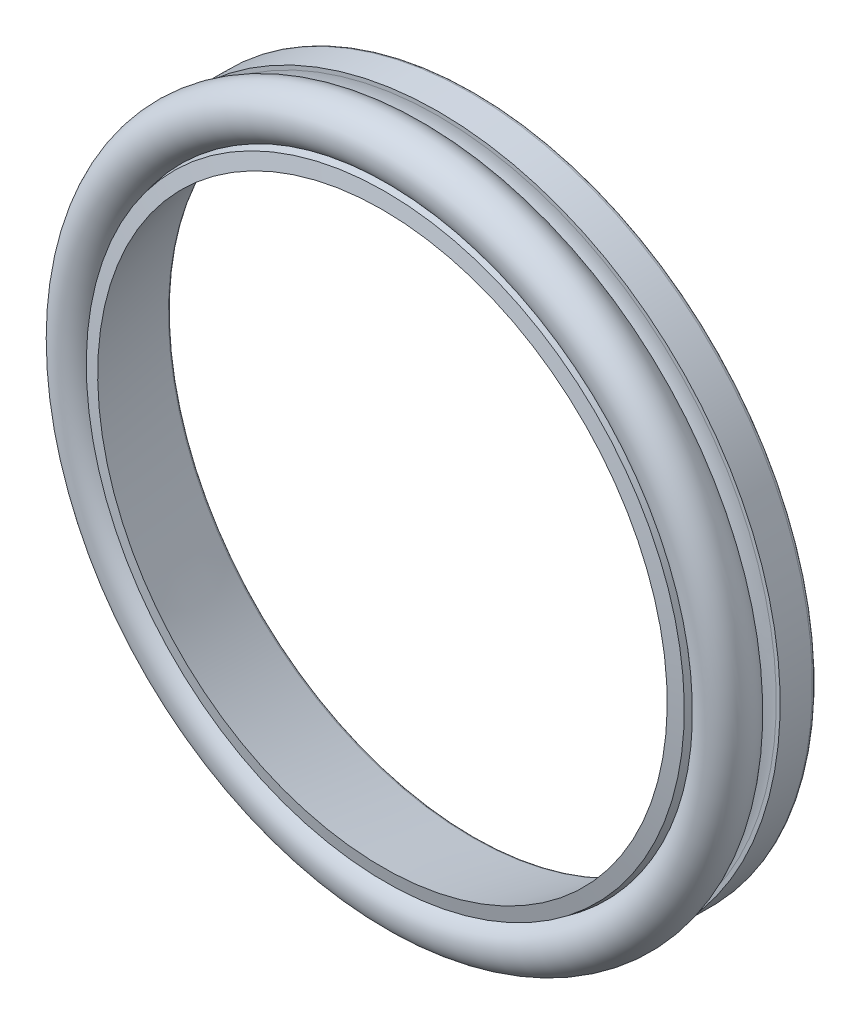
ISO-10303-21;
HEADER;
FILE_DESCRIPTION(('STEP AP214'),'2;1');
FILE_NAME('part.step','',(''),(''),'','','');
FILE_SCHEMA(('AUTOMOTIVE_DESIGN { 1 0 10303 214 1 1 1 1 }'));
ENDSEC;
DATA;
#1=APPLICATION_CONTEXT('core data for automotive mechanical design processes');
#2=APPLICATION_PROTOCOL_DEFINITION('international standard','automotive_design',2000,#1);
#3=PRODUCT_CONTEXT('',#1,'mechanical');
#4=PRODUCT('Part','Part','',(#3));
#5=PRODUCT_RELATED_PRODUCT_CATEGORY('part','',(#4));
#6=PRODUCT_DEFINITION_FORMATION('','',#4);
#7=PRODUCT_DEFINITION_CONTEXT('part definition',#1,'design');
#8=PRODUCT_DEFINITION('design','',#6,#7);
#9=PRODUCT_DEFINITION_SHAPE('','',#8);
#10=(LENGTH_UNIT() NAMED_UNIT(*) SI_UNIT(.MILLI.,.METRE.));
#11=(NAMED_UNIT(*) PLANE_ANGLE_UNIT() SI_UNIT($,.RADIAN.));
#12=(NAMED_UNIT(*) SI_UNIT($,.STERADIAN.) SOLID_ANGLE_UNIT());
#13=UNCERTAINTY_MEASURE_WITH_UNIT(LENGTH_MEASURE(1.E-05),#10,'distance_accuracy_value','');
#14=(GEOMETRIC_REPRESENTATION_CONTEXT(3) GLOBAL_UNCERTAINTY_ASSIGNED_CONTEXT((#13)) GLOBAL_UNIT_ASSIGNED_CONTEXT((#10,
#11,#12)) REPRESENTATION_CONTEXT('',''));
#15=CARTESIAN_POINT('',(0.,0.,0.));
#16=DIRECTION('',(0.,0.,1.));
#17=DIRECTION('',(1.,0.,0.));
#18=AXIS2_PLACEMENT_3D('',#15,#16,#17);
#19=CARTESIAN_POINT('',(0.,0.,3.69));
#20=DIRECTION('',(0.,0.,-1.));
#21=DIRECTION('',(-1.,0.,0.));
#22=AXIS2_PLACEMENT_3D('',#19,#20,#21);
#23=TOROIDAL_SURFACE('',#22,17.02,1.31);
#24=CARTESIAN_POINT('',(-18.33,0.,3.69));
#25=VERTEX_POINT('',#24);
#26=VERTEX_LOOP('',#25);
#27=FACE_BOUND('',#26,.T.);
#28=ADVANCED_FACE('F50',(#27),#23,.T.);
#29=CLOSED_SHELL('',(#28));
#30=MANIFOLD_SOLID_BREP('B2',#29);
#31=CARTESIAN_POINT('',(0.,18.,1.9));
#32=DIRECTION('',(0.,0.,1.));
#33=DIRECTION('',(0.,-1.,0.));
#34=AXIS2_PLACEMENT_3D('',#31,#32,#33);
#35=PLANE('',#34);
#36=CARTESIAN_POINT('',(0.,0.,1.9));
#37=DIRECTION('',(0.,0.,-1.));
#38=DIRECTION('',(0.,1.,0.));
#39=AXIS2_PLACEMENT_3D('',#36,#37,#38);
#40=CIRCLE('',#39,17.794048581835);
#41=CARTESIAN_POINT('',(0.,17.794048581835,1.9));
#42=VERTEX_POINT('',#41);
#43=EDGE_CURVE('E94',#42,#42,#40,.T.);
#44=ORIENTED_EDGE('',*,*,#43,.T.);
#45=EDGE_LOOP('',(#44));
#46=FACE_BOUND('',#45,.T.);
#47=CARTESIAN_POINT('',(0.,0.,1.9));
#48=DIRECTION('',(0.,0.,-1.));
#49=DIRECTION('',(0.,1.,0.));
#50=AXIS2_PLACEMENT_3D('',#47,#48,#49);
#51=CIRCLE('',#50,18.);
#52=CARTESIAN_POINT('',(0.,18.,1.9));
#53=VERTEX_POINT('',#52);
#54=EDGE_CURVE('E82',#53,#53,#51,.T.);
#55=ORIENTED_EDGE('',*,*,#54,.F.);
#56=EDGE_LOOP('',(#55));
#57=FACE_BOUND('',#56,.T.);
#58=ADVANCED_FACE('F62',(#46,#57),#35,.T.);
#59=CARTESIAN_POINT('',(0.,0.,0.));
#60=DIRECTION('',(0.,0.,-1.));
#61=DIRECTION('',(0.,1.,0.));
#62=AXIS2_PLACEMENT_3D('',#59,#60,#61);
#63=CYLINDRICAL_SURFACE('',#62,18.);
#64=CARTESIAN_POINT('',(0.,0.,0.2));
#65=DIRECTION('',(0.,0.,-1.));
#66=DIRECTION('',(0.,1.,0.));
#67=AXIS2_PLACEMENT_3D('',#64,#65,#66);
#68=CIRCLE('',#67,18.);
#69=CARTESIAN_POINT('',(0.,18.,0.200000000000002));
#70=VERTEX_POINT('',#69);
#71=EDGE_CURVE('E69',#70,#70,#68,.F.);
#72=ORIENTED_EDGE('',*,*,#71,.T.);
#73=EDGE_LOOP('',(#72));
#74=FACE_BOUND('',#73,.T.);
#75=ORIENTED_EDGE('',*,*,#54,.T.);
#76=EDGE_LOOP('',(#75));
#77=FACE_BOUND('',#76,.T.);
#78=ADVANCED_FACE('F115',(#74,#77),#63,.T.);
#79=CARTESIAN_POINT('',(0.,18.,0.));
#80=DIRECTION('',(0.,0.,-1.));
#81=DIRECTION('',(0.,1.,0.));
#82=AXIS2_PLACEMENT_3D('',#79,#80,#81);
#83=PLANE('',#82);
#84=CARTESIAN_POINT('',(0.,0.,0.));
#85=DIRECTION('',(0.,0.,-1.));
#86=DIRECTION('',(0.,1.,0.));
#87=AXIS2_PLACEMENT_3D('',#84,#85,#86);
#88=CIRCLE('',#87,17.8);
#89=CARTESIAN_POINT('',(0.,17.8,0.));
#90=VERTEX_POINT('',#89);
#91=EDGE_CURVE('E73',#90,#90,#88,.T.);
#92=ORIENTED_EDGE('',*,*,#91,.T.);
#93=EDGE_LOOP('',(#92));
#94=FACE_BOUND('',#93,.T.);
#95=CARTESIAN_POINT('',(0.,0.,0.));
#96=DIRECTION('',(0.,0.,-1.));
#97=DIRECTION('',(0.,1.,0.));
#98=AXIS2_PLACEMENT_3D('',#95,#96,#97);
#99=CIRCLE('',#98,16.1629698882451);
#100=CARTESIAN_POINT('',(0.,16.1629698882451,0.));
#101=VERTEX_POINT('',#100);
#102=EDGE_CURVE('E77',#101,#101,#99,.F.);
#103=ORIENTED_EDGE('',*,*,#102,.T.);
#104=EDGE_LOOP('',(#103));
#105=FACE_BOUND('',#104,.T.);
#106=ADVANCED_FACE('F120',(#94,#105),#83,.T.);
#107=CARTESIAN_POINT('',(0.,0.,4.85));
#108=DIRECTION('',(0.,0.,-1.));
#109=DIRECTION('',(0.,1.,0.));
#110=AXIS2_PLACEMENT_3D('',#107,#108,#109);
#111=CONICAL_SURFACE('',#110,15.,0.203336084028276);
#112=CARTESIAN_POINT('',(0.,0.,0.159612439270498));
#113=DIRECTION('',(0.,0.,1.));
#114=DIRECTION('',(0.,-1.,0.));
#115=AXIS2_PLACEMENT_3D('',#112,#113,#114);
#116=CIRCLE('',#115,15.9670902187071);
#117=CARTESIAN_POINT('',(0.,-15.9670902187071,0.159612439270496));
#118=VERTEX_POINT('',#117);
#119=EDGE_CURVE('E49',#118,#118,#116,.F.);
#120=ORIENTED_EDGE('',*,*,#119,.T.);
#121=EDGE_LOOP('',(#120));
#122=FACE_BOUND('',#121,.T.);
#123=CARTESIAN_POINT('',(0.,0.,4.85));
#124=DIRECTION('',(0.,0.,-1.));
#125=DIRECTION('',(0.,1.,0.));
#126=AXIS2_PLACEMENT_3D('',#123,#124,#125);
#127=CIRCLE('',#126,15.);
#128=CARTESIAN_POINT('',(0.,15.,4.85));
#129=VERTEX_POINT('',#128);
#130=EDGE_CURVE('E85',#129,#129,#127,.T.);
#131=ORIENTED_EDGE('',*,*,#130,.F.);
#132=EDGE_LOOP('',(#131));
#133=FACE_BOUND('',#132,.T.);
#134=ADVANCED_FACE('F125',(#122,#133),#111,.F.);
#135=CARTESIAN_POINT('',(0.,0.,4.7));
#136=DIRECTION('',(0.,0.,-1.));
#137=DIRECTION('',(0.,1.,0.));
#138=AXIS2_PLACEMENT_3D('',#135,#136,#137);
#139=CONICAL_SURFACE('',#138,15.75,1.37340076694502);
#140=ORIENTED_EDGE('',*,*,#130,.T.);
#141=EDGE_LOOP('',(#140));
#142=FACE_BOUND('',#141,.T.);
#143=CARTESIAN_POINT('',(0.,0.,4.7));
#144=DIRECTION('',(0.,0.,-1.));
#145=DIRECTION('',(0.,1.,0.));
#146=AXIS2_PLACEMENT_3D('',#143,#144,#145);
#147=CIRCLE('',#146,15.75);
#148=CARTESIAN_POINT('',(0.,15.75,4.7));
#149=VERTEX_POINT('',#148);
#150=EDGE_CURVE('E88',#149,#149,#147,.T.);
#151=ORIENTED_EDGE('',*,*,#150,.F.);
#152=EDGE_LOOP('',(#151));
#153=FACE_BOUND('',#152,.T.);
#154=ADVANCED_FACE('F111',(#142,#153),#139,.T.);
#155=CARTESIAN_POINT('',(0.,0.,3.33651195343461));
#156=DIRECTION('',(0.,0.,-1.));
#157=DIRECTION('',(0.,1.,0.));
#158=AXIS2_PLACEMENT_3D('',#155,#156,#157);
#159=CONICAL_SURFACE('',#158,16.0311315559929,0.203336084028278);
#160=ORIENTED_EDGE('',*,*,#150,.T.);
#161=EDGE_LOOP('',(#160));
#162=FACE_BOUND('',#161,.T.);
#163=CARTESIAN_POINT('',(0.,0.,3.33651195343461));
#164=DIRECTION('',(0.,0.,-1.));
#165=DIRECTION('',(0.,1.,0.));
#166=AXIS2_PLACEMENT_3D('',#163,#164,#165);
#167=CIRCLE('',#166,16.0311315559929);
#168=CARTESIAN_POINT('',(0.,16.0311315559929,3.33651195343461));
#169=VERTEX_POINT('',#168);
#170=EDGE_CURVE('E91',#169,#169,#167,.T.);
#171=ORIENTED_EDGE('',*,*,#170,.F.);
#172=EDGE_LOOP('',(#171));
#173=FACE_BOUND('',#172,.T.);
#174=ADVANCED_FACE('F103',(#162,#173),#159,.T.);
#175=CARTESIAN_POINT('',(0.,0.,3.7));
#176=DIRECTION('',(0.,0.,-1.));
#177=DIRECTION('',(0.,1.,0.));
#178=AXIS2_PLACEMENT_3D('',#175,#176,#177);
#179=TOROIDAL_SURFACE('',#178,17.794048581835,1.8);
#180=ORIENTED_EDGE('',*,*,#170,.T.);
#181=EDGE_LOOP('',(#180));
#182=FACE_BOUND('',#181,.T.);
#183=ORIENTED_EDGE('',*,*,#43,.F.);
#184=EDGE_LOOP('',(#183));
#185=FACE_BOUND('',#184,.T.);
#186=ADVANCED_FACE('F100',(#182,#185),#179,.F.);
#187=CARTESIAN_POINT('',(0.,0.,0.2));
#188=DIRECTION('',(0.,0.,-1.));
#189=DIRECTION('',(0.,1.,0.));
#190=AXIS2_PLACEMENT_3D('',#187,#188,#189);
#191=TOROIDAL_SURFACE('',#190,17.8,0.2);
#192=ORIENTED_EDGE('',*,*,#71,.F.);
#193=EDGE_LOOP('',(#192));
#194=FACE_BOUND('',#193,.T.);
#195=ORIENTED_EDGE('',*,*,#91,.F.);
#196=EDGE_LOOP('',(#195));
#197=FACE_BOUND('',#196,.T.);
#198=ADVANCED_FACE('F102',(#194,#197),#191,.T.);
#199=CARTESIAN_POINT('',(0.,0.,0.2));
#200=DIRECTION('',(0.,0.,-1.));
#201=DIRECTION('',(0.,1.,0.));
#202=AXIS2_PLACEMENT_3D('',#199,#200,#201);
#203=TOROIDAL_SURFACE('',#202,16.1629698882451,0.2);
#204=ORIENTED_EDGE('',*,*,#102,.F.);
#205=EDGE_LOOP('',(#204));
#206=FACE_BOUND('',#205,.T.);
#207=ORIENTED_EDGE('',*,*,#119,.F.);
#208=EDGE_LOOP('',(#207));
#209=FACE_BOUND('',#208,.T.);
#210=ADVANCED_FACE('F64',(#206,#209),#203,.T.);
#211=CLOSED_SHELL('',(#58,#78,#106,#134,#154,#174,#186,#198,#210));
#212=MANIFOLD_SOLID_BREP('B7',#211);
#213=ADVANCED_BREP_SHAPE_REPRESENTATION('',(#18,#30,#212),#14);
#214=SHAPE_DEFINITION_REPRESENTATION(#9,#213);
ENDSEC;
END-ISO-10303-21;
